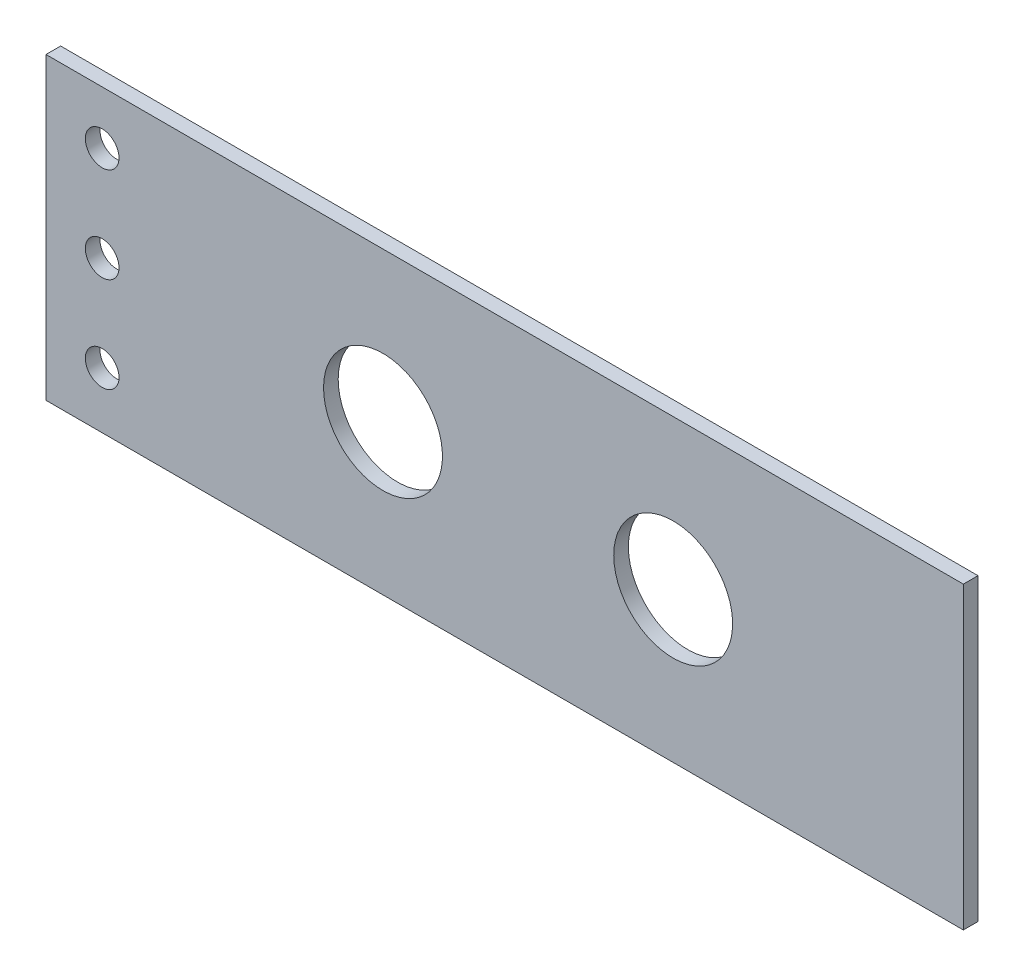
ISO-10303-21;
HEADER;
FILE_DESCRIPTION(('STEP AP214'),'2;1');
FILE_NAME('part.step','',(''),(''),'','','');
FILE_SCHEMA(('AUTOMOTIVE_DESIGN { 1 0 10303 214 1 1 1 1 }'));
ENDSEC;
DATA;
#1=APPLICATION_CONTEXT('core data for automotive mechanical design processes');
#2=APPLICATION_PROTOCOL_DEFINITION('international standard','automotive_design',2000,#1);
#3=PRODUCT_CONTEXT('',#1,'mechanical');
#4=PRODUCT('Part','Part','',(#3));
#5=PRODUCT_RELATED_PRODUCT_CATEGORY('part','',(#4));
#6=PRODUCT_DEFINITION_FORMATION('','',#4);
#7=PRODUCT_DEFINITION_CONTEXT('part definition',#1,'design');
#8=PRODUCT_DEFINITION('design','',#6,#7);
#9=PRODUCT_DEFINITION_SHAPE('','',#8);
#10=(LENGTH_UNIT() NAMED_UNIT(*) SI_UNIT(.MILLI.,.METRE.));
#11=(NAMED_UNIT(*) PLANE_ANGLE_UNIT() SI_UNIT($,.RADIAN.));
#12=(NAMED_UNIT(*) SI_UNIT($,.STERADIAN.) SOLID_ANGLE_UNIT());
#13=UNCERTAINTY_MEASURE_WITH_UNIT(LENGTH_MEASURE(1.E-05),#10,'distance_accuracy_value','');
#14=(GEOMETRIC_REPRESENTATION_CONTEXT(3) GLOBAL_UNCERTAINTY_ASSIGNED_CONTEXT((#13)) GLOBAL_UNIT_ASSIGNED_CONTEXT((#10,
#11,#12)) REPRESENTATION_CONTEXT('',''));
#15=CARTESIAN_POINT('',(0.,0.,0.));
#16=DIRECTION('',(0.,0.,1.));
#17=DIRECTION('',(1.,0.,0.));
#18=AXIS2_PLACEMENT_3D('',#15,#16,#17);
#19=CARTESIAN_POINT('',(-5.49999916,-3.99999962,0.39116));
#20=DIRECTION('',(0.,0.,-1.));
#21=DIRECTION('',(-1.,0.,0.));
#22=AXIS2_PLACEMENT_3D('',#19,#20,#21);
#23=PLANE('',#22);
#24=CARTESIAN_POINT('',(3.50000062,0.,0.39116));
#25=DIRECTION('',(0.,0.,-1.));
#26=DIRECTION('',(-1.,0.,0.));
#27=AXIS2_PLACEMENT_3D('',#24,#25,#26);
#28=CIRCLE('',#27,1.5875);
#29=CARTESIAN_POINT('',(1.91250062,0.,0.39116));
#30=VERTEX_POINT('',#29);
#31=EDGE_CURVE('E94',#30,#30,#28,.T.);
#32=ORIENTED_EDGE('',*,*,#31,.T.);
#33=EDGE_LOOP('',(#32));
#34=FACE_BOUND('',#33,.T.);
#35=CARTESIAN_POINT('',(-3.99999962,2.57999992,0.39116));
#36=DIRECTION('',(0.,0.,-1.));
#37=DIRECTION('',(-1.,0.,0.));
#38=AXIS2_PLACEMENT_3D('',#35,#36,#37);
#39=CIRCLE('',#38,0.4499991);
#40=CARTESIAN_POINT('',(-4.44999872,2.57999992,0.39116));
#41=VERTEX_POINT('',#40);
#42=EDGE_CURVE('E98',#41,#41,#39,.T.);
#43=ORIENTED_EDGE('',*,*,#42,.T.);
#44=EDGE_LOOP('',(#43));
#45=FACE_BOUND('',#44,.T.);
#46=CARTESIAN_POINT('',(11.25000036,0.,0.39116));
#47=DIRECTION('',(0.,0.,-1.));
#48=DIRECTION('',(-1.,0.,0.));
#49=AXIS2_PLACEMENT_3D('',#46,#47,#48);
#50=CIRCLE('',#49,1.5875);
#51=CARTESIAN_POINT('',(9.66250036,0.,0.39116));
#52=VERTEX_POINT('',#51);
#53=EDGE_CURVE('E101',#52,#52,#50,.T.);
#54=ORIENTED_EDGE('',*,*,#53,.T.);
#55=EDGE_LOOP('',(#54));
#56=FACE_BOUND('',#55,.T.);
#57=CARTESIAN_POINT('',(-3.99999962,0.03999992,0.39116));
#58=DIRECTION('',(0.,0.,-1.));
#59=DIRECTION('',(-1.,0.,0.));
#60=AXIS2_PLACEMENT_3D('',#57,#58,#59);
#61=CIRCLE('',#60,0.4499991);
#62=CARTESIAN_POINT('',(-4.44999872,0.03999992,0.39116));
#63=VERTEX_POINT('',#62);
#64=EDGE_CURVE('E103',#63,#63,#61,.T.);
#65=ORIENTED_EDGE('',*,*,#64,.T.);
#66=EDGE_LOOP('',(#65));
#67=FACE_BOUND('',#66,.T.);
#68=CARTESIAN_POINT('',(-3.99999962,-2.50000008,0.39116));
#69=DIRECTION('',(0.,0.,-1.));
#70=DIRECTION('',(-1.,0.,0.));
#71=AXIS2_PLACEMENT_3D('',#68,#69,#70);
#72=CIRCLE('',#71,0.4499991);
#73=CARTESIAN_POINT('',(-4.44999872,-2.50000008,0.39116));
#74=VERTEX_POINT('',#73);
#75=EDGE_CURVE('E20',#74,#74,#72,.T.);
#76=ORIENTED_EDGE('',*,*,#75,.T.);
#77=EDGE_LOOP('',(#76));
#78=FACE_BOUND('',#77,.T.);
#79=DIRECTION('',(0.,1.,0.));
#80=VECTOR('',#79,1.);
#81=CARTESIAN_POINT('',(19.0000001,-3.99999962,0.39116));
#82=LINE('',#81,#80);
#83=CARTESIAN_POINT('',(19.0000001,-3.99999962,0.39116));
#84=VERTEX_POINT('',#83);
#85=CARTESIAN_POINT('',(19.0000001,3.99999962,0.39116));
#86=VERTEX_POINT('',#85);
#87=EDGE_CURVE('E55',#84,#86,#82,.T.);
#88=ORIENTED_EDGE('',*,*,#87,.T.);
#89=DIRECTION('',(1.,0.,0.));
#90=VECTOR('',#89,1.);
#91=CARTESIAN_POINT('',(19.0000001,3.99999962,0.39116));
#92=LINE('',#91,#90);
#93=CARTESIAN_POINT('',(-5.49999916,3.99999962,0.39116));
#94=VERTEX_POINT('',#93);
#95=EDGE_CURVE('E57',#86,#94,#92,.F.);
#96=ORIENTED_EDGE('',*,*,#95,.T.);
#97=DIRECTION('',(0.,1.,0.));
#98=VECTOR('',#97,1.);
#99=CARTESIAN_POINT('',(-5.49999916,3.99999962,0.39116));
#100=LINE('',#99,#98);
#101=CARTESIAN_POINT('',(-5.49999916,-3.99999962,0.39116));
#102=VERTEX_POINT('',#101);
#103=EDGE_CURVE('E59',#94,#102,#100,.F.);
#104=ORIENTED_EDGE('',*,*,#103,.T.);
#105=DIRECTION('',(1.,0.,0.));
#106=VECTOR('',#105,1.);
#107=CARTESIAN_POINT('',(-5.49999916,-3.99999962,0.39116));
#108=LINE('',#107,#106);
#109=EDGE_CURVE('E110',#102,#84,#108,.T.);
#110=ORIENTED_EDGE('',*,*,#109,.T.);
#111=EDGE_LOOP('',(#88,#96,#104,#110));
#112=FACE_BOUND('',#111,.T.);
#113=ADVANCED_FACE('F17',(#34,#45,#56,#67,#78,#112),#23,.F.);
#114=CARTESIAN_POINT('',(-5.49999916,3.99999962,0.));
#115=DIRECTION('',(1.,0.,0.));
#116=DIRECTION('',(0.,0.,-1.));
#117=AXIS2_PLACEMENT_3D('',#114,#115,#116);
#118=PLANE('',#117);
#119=DIRECTION('',(0.,0.,1.));
#120=VECTOR('',#119,1.);
#121=CARTESIAN_POINT('',(-5.49999916,-3.99999962,0.));
#122=LINE('',#121,#120);
#123=CARTESIAN_POINT('',(-5.49999916,-3.99999962,0.));
#124=VERTEX_POINT('',#123);
#125=EDGE_CURVE('E70',#124,#102,#122,.T.);
#126=ORIENTED_EDGE('',*,*,#125,.T.);
#127=ORIENTED_EDGE('',*,*,#103,.F.);
#128=DIRECTION('',(0.,0.,-1.));
#129=VECTOR('',#128,1.);
#130=CARTESIAN_POINT('',(-5.49999916,3.99999962,0.));
#131=LINE('',#130,#129);
#132=CARTESIAN_POINT('',(-5.49999916,3.99999962,0.));
#133=VERTEX_POINT('',#132);
#134=EDGE_CURVE('E64',#94,#133,#131,.T.);
#135=ORIENTED_EDGE('',*,*,#134,.T.);
#136=DIRECTION('',(0.,1.,0.));
#137=VECTOR('',#136,1.);
#138=CARTESIAN_POINT('',(-5.49999916,-3.99999962,0.));
#139=LINE('',#138,#137);
#140=EDGE_CURVE('E97',#124,#133,#139,.T.);
#141=ORIENTED_EDGE('',*,*,#140,.F.);
#142=EDGE_LOOP('',(#126,#127,#135,#141));
#143=FACE_BOUND('',#142,.T.);
#144=ADVANCED_FACE('F67',(#143),#118,.F.);
#145=CARTESIAN_POINT('',(19.0000001,3.99999962,0.));
#146=DIRECTION('',(0.,-1.,0.));
#147=DIRECTION('',(0.,0.,-1.));
#148=AXIS2_PLACEMENT_3D('',#145,#146,#147);
#149=PLANE('',#148);
#150=ORIENTED_EDGE('',*,*,#134,.F.);
#151=ORIENTED_EDGE('',*,*,#95,.F.);
#152=DIRECTION('',(0.,0.,1.));
#153=VECTOR('',#152,1.);
#154=CARTESIAN_POINT('',(19.0000001,3.99999962,0.));
#155=LINE('',#154,#153);
#156=CARTESIAN_POINT('',(19.0000001,3.99999962,0.));
#157=VERTEX_POINT('',#156);
#158=EDGE_CURVE('E78',#86,#157,#155,.F.);
#159=ORIENTED_EDGE('',*,*,#158,.T.);
#160=DIRECTION('',(-1.,0.,0.));
#161=VECTOR('',#160,1.);
#162=CARTESIAN_POINT('',(-5.49999916,3.99999962,0.));
#163=LINE('',#162,#161);
#164=EDGE_CURVE('E75',#133,#157,#163,.F.);
#165=ORIENTED_EDGE('',*,*,#164,.F.);
#166=EDGE_LOOP('',(#150,#151,#159,#165));
#167=FACE_BOUND('',#166,.T.);
#168=ADVANCED_FACE('F73',(#167),#149,.F.);
#169=CARTESIAN_POINT('',(19.0000001,-3.99999962,0.));
#170=DIRECTION('',(-1.,0.,0.));
#171=DIRECTION('',(0.,0.,1.));
#172=AXIS2_PLACEMENT_3D('',#169,#170,#171);
#173=PLANE('',#172);
#174=ORIENTED_EDGE('',*,*,#158,.F.);
#175=ORIENTED_EDGE('',*,*,#87,.F.);
#176=DIRECTION('',(0.,0.,1.));
#177=VECTOR('',#176,1.);
#178=CARTESIAN_POINT('',(19.0000001,-3.99999962,0.));
#179=LINE('',#178,#177);
#180=CARTESIAN_POINT('',(19.0000001,-3.99999962,0.));
#181=VERTEX_POINT('',#180);
#182=EDGE_CURVE('E35',#84,#181,#179,.F.);
#183=ORIENTED_EDGE('',*,*,#182,.T.);
#184=DIRECTION('',(0.,1.,0.));
#185=VECTOR('',#184,1.);
#186=CARTESIAN_POINT('',(19.0000001,-3.99999962,0.));
#187=LINE('',#186,#185);
#188=EDGE_CURVE('E117',#157,#181,#187,.F.);
#189=ORIENTED_EDGE('',*,*,#188,.F.);
#190=EDGE_LOOP('',(#174,#175,#183,#189));
#191=FACE_BOUND('',#190,.T.);
#192=ADVANCED_FACE('F118',(#191),#173,.F.);
#193=CARTESIAN_POINT('',(-5.49999916,-3.99999962,0.));
#194=DIRECTION('',(0.,1.,0.));
#195=DIRECTION('',(0.,0.,1.));
#196=AXIS2_PLACEMENT_3D('',#193,#194,#195);
#197=PLANE('',#196);
#198=ORIENTED_EDGE('',*,*,#182,.F.);
#199=ORIENTED_EDGE('',*,*,#109,.F.);
#200=ORIENTED_EDGE('',*,*,#125,.F.);
#201=DIRECTION('',(-1.,0.,0.));
#202=VECTOR('',#201,1.);
#203=CARTESIAN_POINT('',(-5.49999916,-3.99999962,0.));
#204=LINE('',#203,#202);
#205=EDGE_CURVE('E93',#181,#124,#204,.T.);
#206=ORIENTED_EDGE('',*,*,#205,.F.);
#207=EDGE_LOOP('',(#198,#199,#200,#206));
#208=FACE_BOUND('',#207,.T.);
#209=ADVANCED_FACE('F125',(#208),#197,.F.);
#210=CARTESIAN_POINT('',(-3.99999962,-2.50000008,0.));
#211=DIRECTION('',(0.,0.,-1.));
#212=DIRECTION('',(-1.,0.,0.));
#213=AXIS2_PLACEMENT_3D('',#210,#211,#212);
#214=CYLINDRICAL_SURFACE('',#213,0.4499991);
#215=ORIENTED_EDGE('',*,*,#75,.F.);
#216=EDGE_LOOP('',(#215));
#217=FACE_BOUND('',#216,.T.);
#218=CARTESIAN_POINT('',(-3.99999962,-2.50000008,0.));
#219=DIRECTION('',(0.,0.,-1.));
#220=DIRECTION('',(-1.,0.,0.));
#221=AXIS2_PLACEMENT_3D('',#218,#219,#220);
#222=CIRCLE('',#221,0.4499991);
#223=CARTESIAN_POINT('',(-4.44999872,-2.50000008,0.));
#224=VERTEX_POINT('',#223);
#225=EDGE_CURVE('E90',#224,#224,#222,.F.);
#226=ORIENTED_EDGE('',*,*,#225,.F.);
#227=EDGE_LOOP('',(#226));
#228=FACE_BOUND('',#227,.T.);
#229=ADVANCED_FACE('F127',(#217,#228),#214,.F.);
#230=CARTESIAN_POINT('',(-3.99999962,0.03999992,0.));
#231=DIRECTION('',(0.,0.,-1.));
#232=DIRECTION('',(-1.,0.,0.));
#233=AXIS2_PLACEMENT_3D('',#230,#231,#232);
#234=CYLINDRICAL_SURFACE('',#233,0.4499991);
#235=ORIENTED_EDGE('',*,*,#64,.F.);
#236=EDGE_LOOP('',(#235));
#237=FACE_BOUND('',#236,.T.);
#238=CARTESIAN_POINT('',(-3.99999962,0.03999992,0.));
#239=DIRECTION('',(0.,0.,-1.));
#240=DIRECTION('',(-1.,0.,0.));
#241=AXIS2_PLACEMENT_3D('',#238,#239,#240);
#242=CIRCLE('',#241,0.4499991);
#243=CARTESIAN_POINT('',(-4.44999872,0.03999992,0.));
#244=VERTEX_POINT('',#243);
#245=EDGE_CURVE('E87',#244,#244,#242,.F.);
#246=ORIENTED_EDGE('',*,*,#245,.F.);
#247=EDGE_LOOP('',(#246));
#248=FACE_BOUND('',#247,.T.);
#249=ADVANCED_FACE('F134',(#237,#248),#234,.F.);
#250=CARTESIAN_POINT('',(11.25000036,0.,0.));
#251=DIRECTION('',(0.,0.,-1.));
#252=DIRECTION('',(-1.,0.,0.));
#253=AXIS2_PLACEMENT_3D('',#250,#251,#252);
#254=CYLINDRICAL_SURFACE('',#253,1.5875);
#255=ORIENTED_EDGE('',*,*,#53,.F.);
#256=EDGE_LOOP('',(#255));
#257=FACE_BOUND('',#256,.T.);
#258=CARTESIAN_POINT('',(11.25000036,0.,0.));
#259=DIRECTION('',(0.,0.,-1.));
#260=DIRECTION('',(-1.,0.,0.));
#261=AXIS2_PLACEMENT_3D('',#258,#259,#260);
#262=CIRCLE('',#261,1.5875);
#263=CARTESIAN_POINT('',(9.66250036,0.,0.));
#264=VERTEX_POINT('',#263);
#265=EDGE_CURVE('E84',#264,#264,#262,.F.);
#266=ORIENTED_EDGE('',*,*,#265,.F.);
#267=EDGE_LOOP('',(#266));
#268=FACE_BOUND('',#267,.T.);
#269=ADVANCED_FACE('F152',(#257,#268),#254,.F.);
#270=CARTESIAN_POINT('',(-3.99999962,2.57999992,0.));
#271=DIRECTION('',(0.,0.,-1.));
#272=DIRECTION('',(-1.,0.,0.));
#273=AXIS2_PLACEMENT_3D('',#270,#271,#272);
#274=CYLINDRICAL_SURFACE('',#273,0.4499991);
#275=ORIENTED_EDGE('',*,*,#42,.F.);
#276=EDGE_LOOP('',(#275));
#277=FACE_BOUND('',#276,.T.);
#278=CARTESIAN_POINT('',(-3.99999962,2.57999992,0.));
#279=DIRECTION('',(0.,0.,-1.));
#280=DIRECTION('',(-1.,0.,0.));
#281=AXIS2_PLACEMENT_3D('',#278,#279,#280);
#282=CIRCLE('',#281,0.4499991);
#283=CARTESIAN_POINT('',(-4.44999872,2.57999992,0.));
#284=VERTEX_POINT('',#283);
#285=EDGE_CURVE('E26',#284,#284,#282,.F.);
#286=ORIENTED_EDGE('',*,*,#285,.F.);
#287=EDGE_LOOP('',(#286));
#288=FACE_BOUND('',#287,.T.);
#289=ADVANCED_FACE('F145',(#277,#288),#274,.F.);
#290=CARTESIAN_POINT('',(3.50000062,0.,0.));
#291=DIRECTION('',(0.,0.,-1.));
#292=DIRECTION('',(-1.,0.,0.));
#293=AXIS2_PLACEMENT_3D('',#290,#291,#292);
#294=CYLINDRICAL_SURFACE('',#293,1.5875);
#295=ORIENTED_EDGE('',*,*,#31,.F.);
#296=EDGE_LOOP('',(#295));
#297=FACE_BOUND('',#296,.T.);
#298=CARTESIAN_POINT('',(3.50000062,0.,0.));
#299=DIRECTION('',(0.,0.,-1.));
#300=DIRECTION('',(-1.,0.,0.));
#301=AXIS2_PLACEMENT_3D('',#298,#299,#300);
#302=CIRCLE('',#301,1.5875);
#303=CARTESIAN_POINT('',(1.91250062,0.,0.));
#304=VERTEX_POINT('',#303);
#305=EDGE_CURVE('E11',#304,#304,#302,.F.);
#306=ORIENTED_EDGE('',*,*,#305,.F.);
#307=EDGE_LOOP('',(#306));
#308=FACE_BOUND('',#307,.T.);
#309=ADVANCED_FACE('F139',(#297,#308),#294,.F.);
#310=CARTESIAN_POINT('',(-5.49999916,-3.99999962,0.));
#311=DIRECTION('',(0.,0.,-1.));
#312=DIRECTION('',(-1.,0.,0.));
#313=AXIS2_PLACEMENT_3D('',#310,#311,#312);
#314=PLANE('',#313);
#315=ORIENTED_EDGE('',*,*,#305,.T.);
#316=EDGE_LOOP('',(#315));
#317=FACE_BOUND('',#316,.T.);
#318=ORIENTED_EDGE('',*,*,#285,.T.);
#319=EDGE_LOOP('',(#318));
#320=FACE_BOUND('',#319,.T.);
#321=ORIENTED_EDGE('',*,*,#265,.T.);
#322=EDGE_LOOP('',(#321));
#323=FACE_BOUND('',#322,.T.);
#324=ORIENTED_EDGE('',*,*,#245,.T.);
#325=EDGE_LOOP('',(#324));
#326=FACE_BOUND('',#325,.T.);
#327=ORIENTED_EDGE('',*,*,#225,.T.);
#328=EDGE_LOOP('',(#327));
#329=FACE_BOUND('',#328,.T.);
#330=ORIENTED_EDGE('',*,*,#188,.T.);
#331=ORIENTED_EDGE('',*,*,#205,.T.);
#332=ORIENTED_EDGE('',*,*,#140,.T.);
#333=ORIENTED_EDGE('',*,*,#164,.T.);
#334=EDGE_LOOP('',(#330,#331,#332,#333));
#335=FACE_BOUND('',#334,.T.);
#336=ADVANCED_FACE('F122',(#317,#320,#323,#326,#329,#335),#314,.T.);
#337=CLOSED_SHELL('',(#113,#144,#168,#192,#209,#229,#249,#269,#289,#309,#336));
#338=MANIFOLD_SOLID_BREP('B1',#337);
#339=ADVANCED_BREP_SHAPE_REPRESENTATION('',(#18,#338),#14);
#340=SHAPE_DEFINITION_REPRESENTATION(#9,#339);
ENDSEC;
END-ISO-10303-21;
